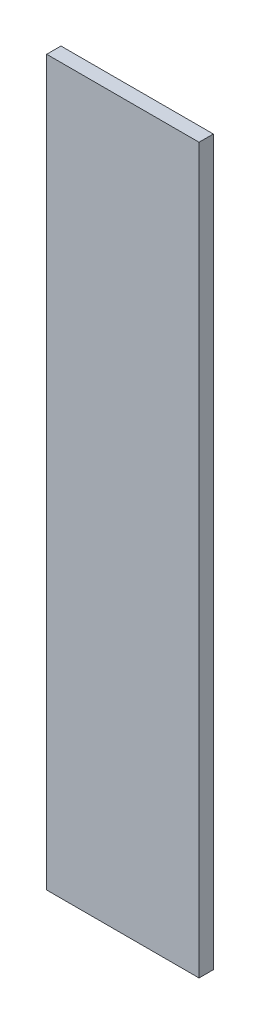
ISO-10303-21;
HEADER;
FILE_DESCRIPTION(('STEP AP214'),'2;1');
FILE_NAME('part.step','',(''),(''),'','','');
FILE_SCHEMA(('AUTOMOTIVE_DESIGN { 1 0 10303 214 1 1 1 1 }'));
ENDSEC;
DATA;
#1=APPLICATION_CONTEXT('core data for automotive mechanical design processes');
#2=APPLICATION_PROTOCOL_DEFINITION('international standard','automotive_design',2000,#1);
#3=PRODUCT_CONTEXT('',#1,'mechanical');
#4=PRODUCT('Part','Part','',(#3));
#5=PRODUCT_RELATED_PRODUCT_CATEGORY('part','',(#4));
#6=PRODUCT_DEFINITION_FORMATION('','',#4);
#7=PRODUCT_DEFINITION_CONTEXT('part definition',#1,'design');
#8=PRODUCT_DEFINITION('design','',#6,#7);
#9=PRODUCT_DEFINITION_SHAPE('','',#8);
#10=(LENGTH_UNIT() NAMED_UNIT(*) SI_UNIT(.MILLI.,.METRE.));
#11=(NAMED_UNIT(*) PLANE_ANGLE_UNIT() SI_UNIT($,.RADIAN.));
#12=(NAMED_UNIT(*) SI_UNIT($,.STERADIAN.) SOLID_ANGLE_UNIT());
#13=UNCERTAINTY_MEASURE_WITH_UNIT(LENGTH_MEASURE(1.E-05),#10,'distance_accuracy_value','');
#14=(GEOMETRIC_REPRESENTATION_CONTEXT(3) GLOBAL_UNCERTAINTY_ASSIGNED_CONTEXT((#13)) GLOBAL_UNIT_ASSIGNED_CONTEXT((#10,
#11,#12)) REPRESENTATION_CONTEXT('',''));
#15=CARTESIAN_POINT('',(0.,0.,0.));
#16=DIRECTION('',(0.,0.,1.));
#17=DIRECTION('',(1.,0.,0.));
#18=AXIS2_PLACEMENT_3D('',#15,#16,#17);
#19=CARTESIAN_POINT('',(0.,0.,30.));
#20=DIRECTION('',(1.,0.,0.));
#21=DIRECTION('',(0.,0.,-1.));
#22=AXIS2_PLACEMENT_3D('',#19,#20,#21);
#23=PLANE('',#22);
#24=DIRECTION('',(0.,-1.,0.));
#25=VECTOR('',#24,1.);
#26=CARTESIAN_POINT('',(0.,0.,0.));
#27=LINE('',#26,#25);
#28=CARTESIAN_POINT('',(0.,1520.,0.));
#29=VERTEX_POINT('',#28);
#30=CARTESIAN_POINT('',(0.,0.,0.));
#31=VERTEX_POINT('',#30);
#32=EDGE_CURVE('E100',#29,#31,#27,.T.);
#33=ORIENTED_EDGE('',*,*,#32,.T.);
#34=DIRECTION('',(0.,0.,-1.));
#35=VECTOR('',#34,1.);
#36=CARTESIAN_POINT('',(0.,0.,30.));
#37=LINE('',#36,#35);
#38=CARTESIAN_POINT('',(0.,0.,30.));
#39=VERTEX_POINT('',#38);
#40=EDGE_CURVE('E11',#39,#31,#37,.T.);
#41=ORIENTED_EDGE('',*,*,#40,.F.);
#42=DIRECTION('',(0.,-1.,0.));
#43=VECTOR('',#42,1.);
#44=CARTESIAN_POINT('',(0.,0.,30.));
#45=LINE('',#44,#43);
#46=CARTESIAN_POINT('',(0.,1520.,30.));
#47=VERTEX_POINT('',#46);
#48=EDGE_CURVE('E88',#47,#39,#45,.T.);
#49=ORIENTED_EDGE('',*,*,#48,.F.);
#50=DIRECTION('',(0.,0.,-1.));
#51=VECTOR('',#50,1.);
#52=CARTESIAN_POINT('',(0.,1520.,30.));
#53=LINE('',#52,#51);
#54=EDGE_CURVE('E96',#47,#29,#53,.T.);
#55=ORIENTED_EDGE('',*,*,#54,.T.);
#56=EDGE_LOOP('',(#33,#41,#49,#55));
#57=FACE_BOUND('',#56,.T.);
#58=ADVANCED_FACE('F37',(#57),#23,.F.);
#59=CARTESIAN_POINT('',(0.,0.,30.));
#60=DIRECTION('',(0.,1.,0.));
#61=DIRECTION('',(0.,0.,1.));
#62=AXIS2_PLACEMENT_3D('',#59,#60,#61);
#63=PLANE('',#62);
#64=DIRECTION('',(1.,0.,0.));
#65=VECTOR('',#64,1.);
#66=CARTESIAN_POINT('',(0.,0.,0.));
#67=LINE('',#66,#65);
#68=CARTESIAN_POINT('',(320.,0.,0.));
#69=VERTEX_POINT('',#68);
#70=EDGE_CURVE('E92',#31,#69,#67,.T.);
#71=ORIENTED_EDGE('',*,*,#70,.T.);
#72=DIRECTION('',(0.,0.,-1.));
#73=VECTOR('',#72,1.);
#74=CARTESIAN_POINT('',(320.,0.,30.));
#75=LINE('',#74,#73);
#76=CARTESIAN_POINT('',(320.,0.,30.));
#77=VERTEX_POINT('',#76);
#78=EDGE_CURVE('E45',#77,#69,#75,.T.);
#79=ORIENTED_EDGE('',*,*,#78,.F.);
#80=DIRECTION('',(1.,0.,0.));
#81=VECTOR('',#80,1.);
#82=CARTESIAN_POINT('',(0.,0.,30.));
#83=LINE('',#82,#81);
#84=EDGE_CURVE('E83',#39,#77,#83,.T.);
#85=ORIENTED_EDGE('',*,*,#84,.F.);
#86=ORIENTED_EDGE('',*,*,#40,.T.);
#87=EDGE_LOOP('',(#71,#79,#85,#86));
#88=FACE_BOUND('',#87,.T.);
#89=ADVANCED_FACE('F91',(#88),#63,.F.);
#90=CARTESIAN_POINT('',(320.,0.,30.));
#91=DIRECTION('',(-1.,0.,0.));
#92=DIRECTION('',(0.,0.,1.));
#93=AXIS2_PLACEMENT_3D('',#90,#91,#92);
#94=PLANE('',#93);
#95=DIRECTION('',(0.,1.,0.));
#96=VECTOR('',#95,1.);
#97=CARTESIAN_POINT('',(320.,0.,0.));
#98=LINE('',#97,#96);
#99=CARTESIAN_POINT('',(320.,1520.,0.));
#100=VERTEX_POINT('',#99);
#101=EDGE_CURVE('E70',#69,#100,#98,.T.);
#102=ORIENTED_EDGE('',*,*,#101,.T.);
#103=DIRECTION('',(0.,0.,-1.));
#104=VECTOR('',#103,1.);
#105=CARTESIAN_POINT('',(320.,1520.,30.));
#106=LINE('',#105,#104);
#107=CARTESIAN_POINT('',(320.,1520.,30.));
#108=VERTEX_POINT('',#107);
#109=EDGE_CURVE('E93',#108,#100,#106,.T.);
#110=ORIENTED_EDGE('',*,*,#109,.F.);
#111=DIRECTION('',(0.,1.,0.));
#112=VECTOR('',#111,1.);
#113=CARTESIAN_POINT('',(320.,0.,30.));
#114=LINE('',#113,#112);
#115=EDGE_CURVE('E86',#77,#108,#114,.T.);
#116=ORIENTED_EDGE('',*,*,#115,.F.);
#117=ORIENTED_EDGE('',*,*,#78,.T.);
#118=EDGE_LOOP('',(#102,#110,#116,#117));
#119=FACE_BOUND('',#118,.T.);
#120=ADVANCED_FACE('F94',(#119),#94,.F.);
#121=CARTESIAN_POINT('',(0.,1520.,30.));
#122=DIRECTION('',(0.,-1.,0.));
#123=DIRECTION('',(0.,0.,-1.));
#124=AXIS2_PLACEMENT_3D('',#121,#122,#123);
#125=PLANE('',#124);
#126=DIRECTION('',(-1.,0.,0.));
#127=VECTOR('',#126,1.);
#128=CARTESIAN_POINT('',(0.,1520.,0.));
#129=LINE('',#128,#127);
#130=EDGE_CURVE('E76',#100,#29,#129,.T.);
#131=ORIENTED_EDGE('',*,*,#130,.T.);
#132=ORIENTED_EDGE('',*,*,#54,.F.);
#133=DIRECTION('',(-1.,0.,0.));
#134=VECTOR('',#133,1.);
#135=CARTESIAN_POINT('',(0.,1520.,30.));
#136=LINE('',#135,#134);
#137=EDGE_CURVE('E53',#108,#47,#136,.T.);
#138=ORIENTED_EDGE('',*,*,#137,.F.);
#139=ORIENTED_EDGE('',*,*,#109,.T.);
#140=EDGE_LOOP('',(#131,#132,#138,#139));
#141=FACE_BOUND('',#140,.T.);
#142=ADVANCED_FACE('F107',(#141),#125,.F.);
#143=CARTESIAN_POINT('',(0.,0.,30.));
#144=DIRECTION('',(0.,0.,-1.));
#145=DIRECTION('',(-1.,0.,0.));
#146=AXIS2_PLACEMENT_3D('',#143,#144,#145);
#147=PLANE('',#146);
#148=ORIENTED_EDGE('',*,*,#48,.T.);
#149=ORIENTED_EDGE('',*,*,#84,.T.);
#150=ORIENTED_EDGE('',*,*,#115,.T.);
#151=ORIENTED_EDGE('',*,*,#137,.T.);
#152=EDGE_LOOP('',(#148,#149,#150,#151));
#153=FACE_BOUND('',#152,.T.);
#154=ADVANCED_FACE('F84',(#153),#147,.F.);
#155=CARTESIAN_POINT('',(0.,0.,0.));
#156=DIRECTION('',(0.,0.,-1.));
#157=DIRECTION('',(-1.,0.,0.));
#158=AXIS2_PLACEMENT_3D('',#155,#156,#157);
#159=PLANE('',#158);
#160=ORIENTED_EDGE('',*,*,#32,.F.);
#161=ORIENTED_EDGE('',*,*,#130,.F.);
#162=ORIENTED_EDGE('',*,*,#101,.F.);
#163=ORIENTED_EDGE('',*,*,#70,.F.);
#164=EDGE_LOOP('',(#160,#161,#162,#163));
#165=FACE_BOUND('',#164,.T.);
#166=ADVANCED_FACE('F110',(#165),#159,.T.);
#167=CLOSED_SHELL('',(#58,#89,#120,#142,#154,#166));
#168=MANIFOLD_SOLID_BREP('B2',#167);
#169=ADVANCED_BREP_SHAPE_REPRESENTATION('',(#18,#168),#14);
#170=SHAPE_DEFINITION_REPRESENTATION(#9,#169);
ENDSEC;
END-ISO-10303-21;
